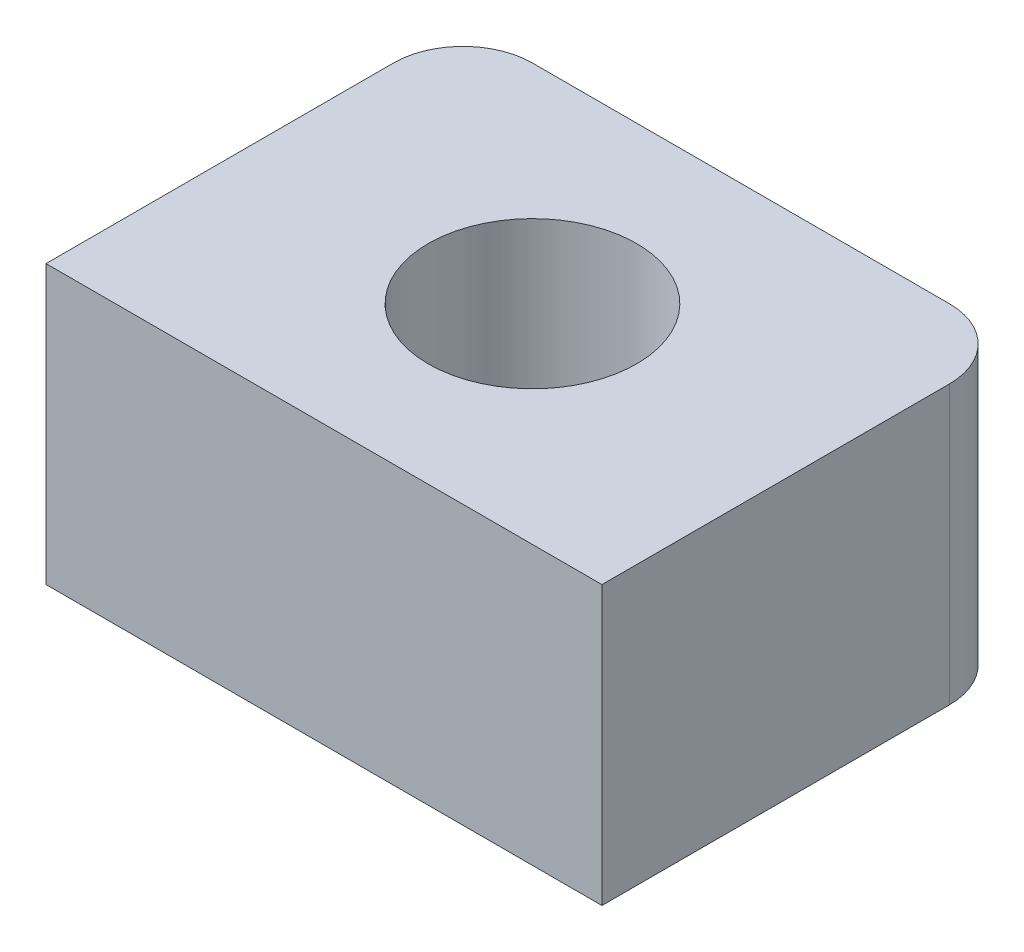
ISO-10303-21;
HEADER;
FILE_DESCRIPTION(('STEP AP214'),'2;1');
FILE_NAME('part.step','',(''),(''),'','','');
FILE_SCHEMA(('AUTOMOTIVE_DESIGN { 1 0 10303 214 1 1 1 1 }'));
ENDSEC;
DATA;
#1=APPLICATION_CONTEXT('core data for automotive mechanical design processes');
#2=APPLICATION_PROTOCOL_DEFINITION('international standard','automotive_design',2000,#1);
#3=PRODUCT_CONTEXT('',#1,'mechanical');
#4=PRODUCT('Part','Part','',(#3));
#5=PRODUCT_RELATED_PRODUCT_CATEGORY('part','',(#4));
#6=PRODUCT_DEFINITION_FORMATION('','',#4);
#7=PRODUCT_DEFINITION_CONTEXT('part definition',#1,'design');
#8=PRODUCT_DEFINITION('design','',#6,#7);
#9=PRODUCT_DEFINITION_SHAPE('','',#8);
#10=(LENGTH_UNIT() NAMED_UNIT(*) SI_UNIT(.MILLI.,.METRE.));
#11=(NAMED_UNIT(*) PLANE_ANGLE_UNIT() SI_UNIT($,.RADIAN.));
#12=(NAMED_UNIT(*) SI_UNIT($,.STERADIAN.) SOLID_ANGLE_UNIT());
#13=UNCERTAINTY_MEASURE_WITH_UNIT(LENGTH_MEASURE(1.E-05),#10,'distance_accuracy_value','');
#14=(GEOMETRIC_REPRESENTATION_CONTEXT(3) GLOBAL_UNCERTAINTY_ASSIGNED_CONTEXT((#13)) GLOBAL_UNIT_ASSIGNED_CONTEXT((#10,
#11,#12)) REPRESENTATION_CONTEXT('',''));
#15=CARTESIAN_POINT('',(0.,0.,0.));
#16=DIRECTION('',(0.,0.,1.));
#17=DIRECTION('',(1.,0.,0.));
#18=AXIS2_PLACEMENT_3D('',#15,#16,#17);
#19=CARTESIAN_POINT('',(0.,12.7,0.));
#20=DIRECTION('',(1.,0.,0.));
#21=DIRECTION('',(0.,0.,-1.));
#22=AXIS2_PLACEMENT_3D('',#19,#20,#21);
#23=PLANE('',#22);
#24=DIRECTION('',(0.,0.,1.));
#25=VECTOR('',#24,1.);
#26=CARTESIAN_POINT('',(0.,12.7,0.));
#27=LINE('',#26,#25);
#28=CARTESIAN_POINT('',(0.,12.7,-15.875));
#29=VERTEX_POINT('',#28);
#30=CARTESIAN_POINT('',(0.,12.7,0.));
#31=VERTEX_POINT('',#30);
#32=EDGE_CURVE('E87',#29,#31,#27,.T.);
#33=ORIENTED_EDGE('',*,*,#32,.F.);
#34=DIRECTION('',(0.,-1.,0.));
#35=VECTOR('',#34,1.);
#36=CARTESIAN_POINT('',(0.,12.7,-15.875));
#37=LINE('',#36,#35);
#38=CARTESIAN_POINT('',(0.,0.,-15.875));
#39=VERTEX_POINT('',#38);
#40=EDGE_CURVE('E110',#29,#39,#37,.T.);
#41=ORIENTED_EDGE('',*,*,#40,.T.);
#42=DIRECTION('',(0.,0.,1.));
#43=VECTOR('',#42,1.);
#44=CARTESIAN_POINT('',(0.,0.,0.));
#45=LINE('',#44,#43);
#46=CARTESIAN_POINT('',(0.,0.,0.));
#47=VERTEX_POINT('',#46);
#48=EDGE_CURVE('E108',#39,#47,#45,.T.);
#49=ORIENTED_EDGE('',*,*,#48,.T.);
#50=DIRECTION('',(0.,-1.,0.));
#51=VECTOR('',#50,1.);
#52=CARTESIAN_POINT('',(0.,12.7,0.));
#53=LINE('',#52,#51);
#54=EDGE_CURVE('E102',#31,#47,#53,.T.);
#55=ORIENTED_EDGE('',*,*,#54,.F.);
#56=EDGE_LOOP('',(#33,#41,#49,#55));
#57=FACE_BOUND('',#56,.T.);
#58=ADVANCED_FACE('F33',(#57),#23,.F.);
#59=CARTESIAN_POINT('',(0.,12.7,0.));
#60=DIRECTION('',(0.,0.,-1.));
#61=DIRECTION('',(-1.,0.,0.));
#62=AXIS2_PLACEMENT_3D('',#59,#60,#61);
#63=PLANE('',#62);
#64=DIRECTION('',(1.,0.,0.));
#65=VECTOR('',#64,1.);
#66=CARTESIAN_POINT('',(0.,0.,0.));
#67=LINE('',#66,#65);
#68=CARTESIAN_POINT('',(25.4,0.,0.));
#69=VERTEX_POINT('',#68);
#70=EDGE_CURVE('E137',#47,#69,#67,.T.);
#71=ORIENTED_EDGE('',*,*,#70,.T.);
#72=DIRECTION('',(0.,-1.,0.));
#73=VECTOR('',#72,1.);
#74=CARTESIAN_POINT('',(25.4,12.7,0.));
#75=LINE('',#74,#73);
#76=CARTESIAN_POINT('',(25.4,12.7,0.));
#77=VERTEX_POINT('',#76);
#78=EDGE_CURVE('E104',#77,#69,#75,.T.);
#79=ORIENTED_EDGE('',*,*,#78,.F.);
#80=DIRECTION('',(1.,0.,0.));
#81=VECTOR('',#80,1.);
#82=CARTESIAN_POINT('',(0.,12.7,0.));
#83=LINE('',#82,#81);
#84=EDGE_CURVE('E90',#31,#77,#83,.T.);
#85=ORIENTED_EDGE('',*,*,#84,.F.);
#86=ORIENTED_EDGE('',*,*,#54,.T.);
#87=EDGE_LOOP('',(#71,#79,#85,#86));
#88=FACE_BOUND('',#87,.T.);
#89=ADVANCED_FACE('F101',(#88),#63,.F.);
#90=CARTESIAN_POINT('',(25.4,12.7,0.));
#91=DIRECTION('',(-1.,0.,0.));
#92=DIRECTION('',(0.,0.,1.));
#93=AXIS2_PLACEMENT_3D('',#90,#91,#92);
#94=PLANE('',#93);
#95=DIRECTION('',(0.,0.,-1.));
#96=VECTOR('',#95,1.);
#97=CARTESIAN_POINT('',(25.4,0.,0.));
#98=LINE('',#97,#96);
#99=CARTESIAN_POINT('',(25.4,0.,-15.875));
#100=VERTEX_POINT('',#99);
#101=EDGE_CURVE('E135',#69,#100,#98,.T.);
#102=ORIENTED_EDGE('',*,*,#101,.T.);
#103=DIRECTION('',(0.,-1.,0.));
#104=VECTOR('',#103,1.);
#105=CARTESIAN_POINT('',(25.4,12.7,-15.875));
#106=LINE('',#105,#104);
#107=CARTESIAN_POINT('',(25.4,12.7,-15.875));
#108=VERTEX_POINT('',#107);
#109=EDGE_CURVE('E11',#100,#108,#106,.F.);
#110=ORIENTED_EDGE('',*,*,#109,.T.);
#111=DIRECTION('',(0.,0.,-1.));
#112=VECTOR('',#111,1.);
#113=CARTESIAN_POINT('',(25.4,12.7,0.));
#114=LINE('',#113,#112);
#115=EDGE_CURVE('E105',#77,#108,#114,.T.);
#116=ORIENTED_EDGE('',*,*,#115,.F.);
#117=ORIENTED_EDGE('',*,*,#78,.T.);
#118=EDGE_LOOP('',(#102,#110,#116,#117));
#119=FACE_BOUND('',#118,.T.);
#120=ADVANCED_FACE('F136',(#119),#94,.F.);
#121=CARTESIAN_POINT('',(0.,12.7,-19.05));
#122=DIRECTION('',(0.,0.,1.));
#123=DIRECTION('',(1.,0.,0.));
#124=AXIS2_PLACEMENT_3D('',#121,#122,#123);
#125=PLANE('',#124);
#126=DIRECTION('',(-1.,0.,0.));
#127=VECTOR('',#126,1.);
#128=CARTESIAN_POINT('',(0.,0.,-19.05));
#129=LINE('',#128,#127);
#130=CARTESIAN_POINT('',(22.225,0.,-19.05));
#131=VERTEX_POINT('',#130);
#132=CARTESIAN_POINT('',(3.175,0.,-19.05));
#133=VERTEX_POINT('',#132);
#134=EDGE_CURVE('E97',#131,#133,#129,.T.);
#135=ORIENTED_EDGE('',*,*,#134,.T.);
#136=DIRECTION('',(0.,-1.,0.));
#137=VECTOR('',#136,1.);
#138=CARTESIAN_POINT('',(3.175,12.7,-19.05));
#139=LINE('',#138,#137);
#140=CARTESIAN_POINT('',(3.175,12.7,-19.05));
#141=VERTEX_POINT('',#140);
#142=EDGE_CURVE('E54',#133,#141,#139,.F.);
#143=ORIENTED_EDGE('',*,*,#142,.T.);
#144=DIRECTION('',(-1.,0.,0.));
#145=VECTOR('',#144,1.);
#146=CARTESIAN_POINT('',(0.,12.7,-19.05));
#147=LINE('',#146,#145);
#148=CARTESIAN_POINT('',(22.225,12.7,-19.05));
#149=VERTEX_POINT('',#148);
#150=EDGE_CURVE('E114',#149,#141,#147,.T.);
#151=ORIENTED_EDGE('',*,*,#150,.F.);
#152=DIRECTION('',(0.,-1.,0.));
#153=VECTOR('',#152,1.);
#154=CARTESIAN_POINT('',(22.225,12.7,-19.05));
#155=LINE('',#154,#153);
#156=EDGE_CURVE('E121',#149,#131,#155,.T.);
#157=ORIENTED_EDGE('',*,*,#156,.T.);
#158=EDGE_LOOP('',(#135,#143,#151,#157));
#159=FACE_BOUND('',#158,.T.);
#160=ADVANCED_FACE('F129',(#159),#125,.F.);
#161=CARTESIAN_POINT('',(0.,12.7,0.));
#162=DIRECTION('',(0.,-1.,0.));
#163=DIRECTION('',(0.,0.,-1.));
#164=AXIS2_PLACEMENT_3D('',#161,#162,#163);
#165=PLANE('',#164);
#166=CARTESIAN_POINT('',(12.7,12.7,-9.525));
#167=DIRECTION('',(0.,1.,0.));
#168=DIRECTION('',(0.,0.,1.));
#169=AXIS2_PLACEMENT_3D('',#166,#167,#168);
#170=CIRCLE('',#169,4.7625);
#171=CARTESIAN_POINT('',(12.7,12.7,-4.7625));
#172=VERTEX_POINT('',#171);
#173=EDGE_CURVE('E144',#172,#172,#170,.T.);
#174=ORIENTED_EDGE('',*,*,#173,.F.);
#175=EDGE_LOOP('',(#174));
#176=FACE_BOUND('',#175,.T.);
#177=ORIENTED_EDGE('',*,*,#150,.T.);
#178=CARTESIAN_POINT('',(3.175,12.7,-15.875));
#179=DIRECTION('',(0.,-1.,0.));
#180=DIRECTION('',(0.,0.,-1.));
#181=AXIS2_PLACEMENT_3D('',#178,#179,#180);
#182=CIRCLE('',#181,3.175);
#183=EDGE_CURVE('E41',#141,#29,#182,.F.);
#184=ORIENTED_EDGE('',*,*,#183,.T.);
#185=ORIENTED_EDGE('',*,*,#32,.T.);
#186=ORIENTED_EDGE('',*,*,#84,.T.);
#187=ORIENTED_EDGE('',*,*,#115,.T.);
#188=CARTESIAN_POINT('',(22.225,12.7,-15.875));
#189=DIRECTION('',(0.,-1.,0.));
#190=DIRECTION('',(0.,0.,-1.));
#191=AXIS2_PLACEMENT_3D('',#188,#189,#190);
#192=CIRCLE('',#191,3.175);
#193=EDGE_CURVE('E125',#108,#149,#192,.F.);
#194=ORIENTED_EDGE('',*,*,#193,.T.);
#195=EDGE_LOOP('',(#177,#184,#185,#186,#187,#194));
#196=FACE_BOUND('',#195,.T.);
#197=ADVANCED_FACE('F89',(#176,#196),#165,.F.);
#198=CARTESIAN_POINT('',(0.,0.,0.));
#199=DIRECTION('',(0.,-1.,0.));
#200=DIRECTION('',(0.,0.,-1.));
#201=AXIS2_PLACEMENT_3D('',#198,#199,#200);
#202=PLANE('',#201);
#203=CARTESIAN_POINT('',(12.7,0.,-9.525));
#204=DIRECTION('',(0.,1.,0.));
#205=DIRECTION('',(0.,0.,1.));
#206=AXIS2_PLACEMENT_3D('',#203,#204,#205);
#207=CIRCLE('',#206,4.7625);
#208=CARTESIAN_POINT('',(12.7,0.,-4.7625));
#209=VERTEX_POINT('',#208);
#210=EDGE_CURVE('E141',#209,#209,#207,.T.);
#211=ORIENTED_EDGE('',*,*,#210,.T.);
#212=EDGE_LOOP('',(#211));
#213=FACE_BOUND('',#212,.T.);
#214=ORIENTED_EDGE('',*,*,#48,.F.);
#215=CARTESIAN_POINT('',(3.175,0.,-15.875));
#216=DIRECTION('',(0.,-1.,0.));
#217=DIRECTION('',(0.,0.,-1.));
#218=AXIS2_PLACEMENT_3D('',#215,#216,#217);
#219=CIRCLE('',#218,3.175);
#220=EDGE_CURVE('E119',#39,#133,#219,.T.);
#221=ORIENTED_EDGE('',*,*,#220,.T.);
#222=ORIENTED_EDGE('',*,*,#134,.F.);
#223=CARTESIAN_POINT('',(22.225,0.,-15.875));
#224=DIRECTION('',(0.,-1.,0.));
#225=DIRECTION('',(0.,0.,-1.));
#226=AXIS2_PLACEMENT_3D('',#223,#224,#225);
#227=CIRCLE('',#226,3.175);
#228=EDGE_CURVE('E112',#131,#100,#227,.T.);
#229=ORIENTED_EDGE('',*,*,#228,.T.);
#230=ORIENTED_EDGE('',*,*,#101,.F.);
#231=ORIENTED_EDGE('',*,*,#70,.F.);
#232=EDGE_LOOP('',(#214,#221,#222,#229,#230,#231));
#233=FACE_BOUND('',#232,.T.);
#234=ADVANCED_FACE('F134',(#213,#233),#202,.T.);
#235=CARTESIAN_POINT('',(12.7,0.,-9.525));
#236=DIRECTION('',(0.,1.,0.));
#237=DIRECTION('',(0.,0.,1.));
#238=AXIS2_PLACEMENT_3D('',#235,#236,#237);
#239=CYLINDRICAL_SURFACE('',#238,4.7625);
#240=ORIENTED_EDGE('',*,*,#210,.F.);
#241=EDGE_LOOP('',(#240));
#242=FACE_BOUND('',#241,.T.);
#243=ORIENTED_EDGE('',*,*,#173,.T.);
#244=EDGE_LOOP('',(#243));
#245=FACE_BOUND('',#244,.T.);
#246=ADVANCED_FACE('F151',(#242,#245),#239,.F.);
#247=CARTESIAN_POINT('',(3.175,12.7,-15.875));
#248=DIRECTION('',(0.,-1.,0.));
#249=DIRECTION('',(0.,0.,-1.));
#250=AXIS2_PLACEMENT_3D('',#247,#248,#249);
#251=CYLINDRICAL_SURFACE('',#250,3.175);
#252=ORIENTED_EDGE('',*,*,#183,.F.);
#253=ORIENTED_EDGE('',*,*,#142,.F.);
#254=ORIENTED_EDGE('',*,*,#220,.F.);
#255=ORIENTED_EDGE('',*,*,#40,.F.);
#256=EDGE_LOOP('',(#252,#253,#254,#255));
#257=FACE_BOUND('',#256,.T.);
#258=ADVANCED_FACE('F154',(#257),#251,.T.);
#259=CARTESIAN_POINT('',(22.225,12.7,-15.875));
#260=DIRECTION('',(0.,-1.,0.));
#261=DIRECTION('',(0.,0.,-1.));
#262=AXIS2_PLACEMENT_3D('',#259,#260,#261);
#263=CYLINDRICAL_SURFACE('',#262,3.175);
#264=ORIENTED_EDGE('',*,*,#193,.F.);
#265=ORIENTED_EDGE('',*,*,#109,.F.);
#266=ORIENTED_EDGE('',*,*,#228,.F.);
#267=ORIENTED_EDGE('',*,*,#156,.F.);
#268=EDGE_LOOP('',(#264,#265,#266,#267));
#269=FACE_BOUND('',#268,.T.);
#270=ADVANCED_FACE('F35',(#269),#263,.T.);
#271=CLOSED_SHELL('',(#58,#89,#120,#160,#197,#234,#246,#258,#270));
#272=MANIFOLD_SOLID_BREP('B2',#271);
#273=ADVANCED_BREP_SHAPE_REPRESENTATION('',(#18,#272),#14);
#274=SHAPE_DEFINITION_REPRESENTATION(#9,#273);
ENDSEC;
END-ISO-10303-21;
